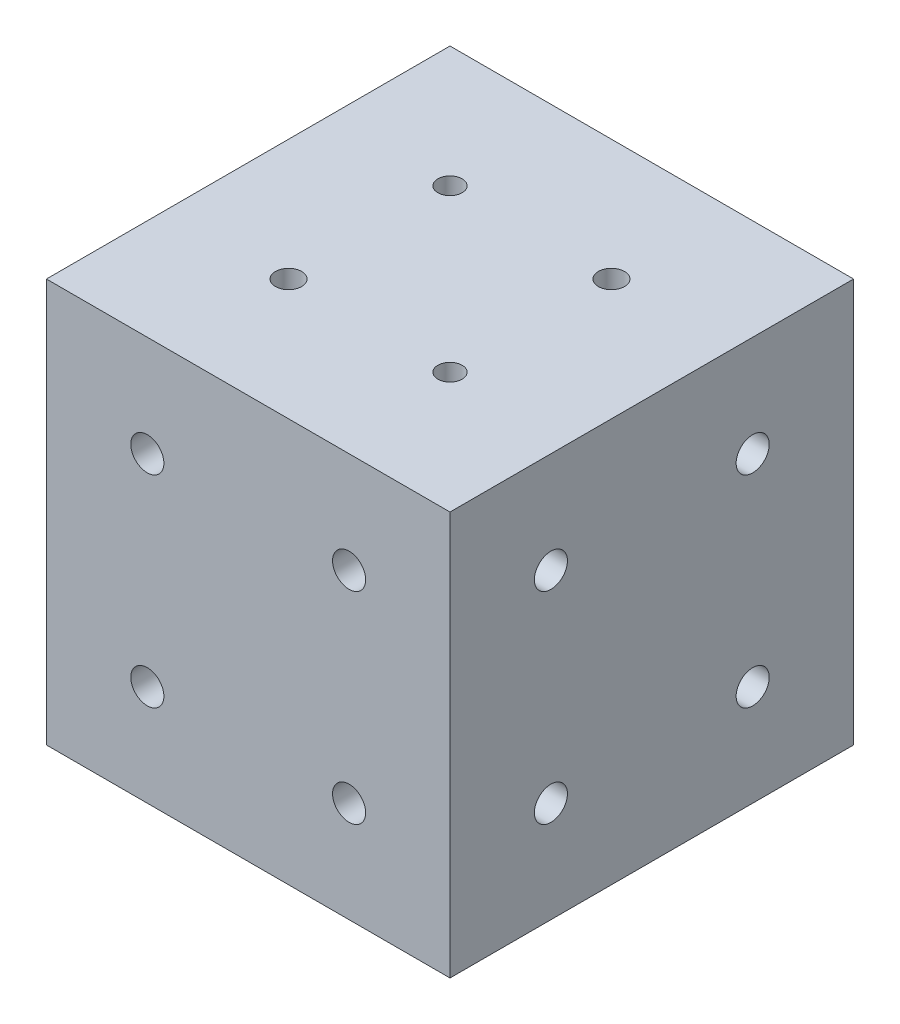
ISO-10303-21;
HEADER;
FILE_DESCRIPTION(('STEP AP214'),'2;1');
FILE_NAME('part.step','',(''),(''),'','','');
FILE_SCHEMA(('AUTOMOTIVE_DESIGN { 1 0 10303 214 1 1 1 1 }'));
ENDSEC;
DATA;
#1=APPLICATION_CONTEXT('core data for automotive mechanical design processes');
#2=APPLICATION_PROTOCOL_DEFINITION('international standard','automotive_design',2000,#1);
#3=PRODUCT_CONTEXT('',#1,'mechanical');
#4=PRODUCT('Part','Part','',(#3));
#5=PRODUCT_RELATED_PRODUCT_CATEGORY('part','',(#4));
#6=PRODUCT_DEFINITION_FORMATION('','',#4);
#7=PRODUCT_DEFINITION_CONTEXT('part definition',#1,'design');
#8=PRODUCT_DEFINITION('design','',#6,#7);
#9=PRODUCT_DEFINITION_SHAPE('','',#8);
#10=(LENGTH_UNIT() NAMED_UNIT(*) SI_UNIT(.MILLI.,.METRE.));
#11=(NAMED_UNIT(*) PLANE_ANGLE_UNIT() SI_UNIT($,.RADIAN.));
#12=(NAMED_UNIT(*) SI_UNIT($,.STERADIAN.) SOLID_ANGLE_UNIT());
#13=UNCERTAINTY_MEASURE_WITH_UNIT(LENGTH_MEASURE(1.E-05),#10,'distance_accuracy_value','');
#14=(GEOMETRIC_REPRESENTATION_CONTEXT(3) GLOBAL_UNCERTAINTY_ASSIGNED_CONTEXT((#13)) GLOBAL_UNIT_ASSIGNED_CONTEXT((#10,
#11,#12)) REPRESENTATION_CONTEXT('',''));
#15=CARTESIAN_POINT('',(0.,0.,0.));
#16=DIRECTION('',(0.,0.,1.));
#17=DIRECTION('',(1.,0.,0.));
#18=AXIS2_PLACEMENT_3D('',#15,#16,#17);
#19=CARTESIAN_POINT('',(-20.,-50.,-20.));
#20=DIRECTION('',(0.,1.,0.));
#21=DIRECTION('',(0.,0.,1.));
#22=AXIS2_PLACEMENT_3D('',#19,#20,#21);
#23=CYLINDRICAL_SURFACE('',#22,3.);
#24=CARTESIAN_POINT('',(-20.,50.,-20.));
#25=DIRECTION('',(0.,1.,0.));
#26=DIRECTION('',(0.,0.,1.));
#27=AXIS2_PLACEMENT_3D('',#24,#25,#26);
#28=CIRCLE('',#27,3.);
#29=CARTESIAN_POINT('',(-20.,50.,-17.));
#30=VERTEX_POINT('',#29);
#31=EDGE_CURVE('E226',#30,#30,#28,.T.);
#32=ORIENTED_EDGE('',*,*,#31,.T.);
#33=EDGE_LOOP('',(#32));
#34=FACE_BOUND('',#33,.T.);
#35=CARTESIAN_POINT('',(-20.,40.,-20.));
#36=DIRECTION('',(0.,-1.,0.));
#37=DIRECTION('',(0.,0.,-1.));
#38=AXIS2_PLACEMENT_3D('',#35,#36,#37);
#39=CIRCLE('',#38,3.);
#40=CARTESIAN_POINT('',(-20.,40.,-23.));
#41=VERTEX_POINT('',#40);
#42=EDGE_CURVE('E168',#41,#41,#39,.F.);
#43=ORIENTED_EDGE('',*,*,#42,.F.);
#44=EDGE_LOOP('',(#43));
#45=FACE_BOUND('',#44,.T.);
#46=ADVANCED_FACE('F41',(#34,#45),#23,.F.);
#47=CARTESIAN_POINT('',(-20.,-50.,20.));
#48=DIRECTION('',(0.,1.,0.));
#49=DIRECTION('',(0.,0.,1.));
#50=AXIS2_PLACEMENT_3D('',#47,#48,#49);
#51=CYLINDRICAL_SURFACE('',#50,3.25);
#52=CARTESIAN_POINT('',(-20.,50.,20.));
#53=DIRECTION('',(0.,1.,0.));
#54=DIRECTION('',(0.,0.,1.));
#55=AXIS2_PLACEMENT_3D('',#52,#53,#54);
#56=CIRCLE('',#55,3.25);
#57=CARTESIAN_POINT('',(-20.,50.,23.25));
#58=VERTEX_POINT('',#57);
#59=EDGE_CURVE('E237',#58,#58,#56,.T.);
#60=ORIENTED_EDGE('',*,*,#59,.T.);
#61=EDGE_LOOP('',(#60));
#62=FACE_BOUND('',#61,.T.);
#63=CARTESIAN_POINT('',(-20.,40.,20.));
#64=DIRECTION('',(0.,-1.,0.));
#65=DIRECTION('',(0.,0.,-1.));
#66=AXIS2_PLACEMENT_3D('',#63,#64,#65);
#67=CIRCLE('',#66,3.25);
#68=CARTESIAN_POINT('',(-20.,40.,16.75));
#69=VERTEX_POINT('',#68);
#70=EDGE_CURVE('E170',#69,#69,#67,.F.);
#71=ORIENTED_EDGE('',*,*,#70,.F.);
#72=EDGE_LOOP('',(#71));
#73=FACE_BOUND('',#72,.T.);
#74=ADVANCED_FACE('F344',(#62,#73),#51,.F.);
#75=CARTESIAN_POINT('',(20.,-50.,-20.));
#76=DIRECTION('',(0.,1.,0.));
#77=DIRECTION('',(0.,0.,1.));
#78=AXIS2_PLACEMENT_3D('',#75,#76,#77);
#79=CYLINDRICAL_SURFACE('',#78,3.25);
#80=CARTESIAN_POINT('',(20.,50.,-20.));
#81=DIRECTION('',(0.,1.,0.));
#82=DIRECTION('',(0.,0.,1.));
#83=AXIS2_PLACEMENT_3D('',#80,#81,#82);
#84=CIRCLE('',#83,3.25);
#85=CARTESIAN_POINT('',(20.,50.,-16.75));
#86=VERTEX_POINT('',#85);
#87=EDGE_CURVE('E230',#86,#86,#84,.T.);
#88=ORIENTED_EDGE('',*,*,#87,.T.);
#89=EDGE_LOOP('',(#88));
#90=FACE_BOUND('',#89,.T.);
#91=CARTESIAN_POINT('',(20.,40.,-20.));
#92=DIRECTION('',(0.,-1.,0.));
#93=DIRECTION('',(0.,0.,-1.));
#94=AXIS2_PLACEMENT_3D('',#91,#92,#93);
#95=CIRCLE('',#94,3.25);
#96=CARTESIAN_POINT('',(20.,40.,-23.25));
#97=VERTEX_POINT('',#96);
#98=EDGE_CURVE('E163',#97,#97,#95,.F.);
#99=ORIENTED_EDGE('',*,*,#98,.F.);
#100=EDGE_LOOP('',(#99));
#101=FACE_BOUND('',#100,.T.);
#102=ADVANCED_FACE('F348',(#90,#101),#79,.F.);
#103=CARTESIAN_POINT('',(20.,-50.,20.));
#104=DIRECTION('',(0.,1.,0.));
#105=DIRECTION('',(0.,0.,1.));
#106=AXIS2_PLACEMENT_3D('',#103,#104,#105);
#107=CYLINDRICAL_SURFACE('',#106,3.);
#108=CARTESIAN_POINT('',(20.,50.,20.));
#109=DIRECTION('',(0.,1.,0.));
#110=DIRECTION('',(0.,0.,1.));
#111=AXIS2_PLACEMENT_3D('',#108,#109,#110);
#112=CIRCLE('',#111,3.);
#113=CARTESIAN_POINT('',(20.,50.,23.));
#114=VERTEX_POINT('',#113);
#115=EDGE_CURVE('E224',#114,#114,#112,.T.);
#116=ORIENTED_EDGE('',*,*,#115,.T.);
#117=EDGE_LOOP('',(#116));
#118=FACE_BOUND('',#117,.T.);
#119=CARTESIAN_POINT('',(20.,40.,20.));
#120=DIRECTION('',(0.,-1.,0.));
#121=DIRECTION('',(0.,0.,-1.));
#122=AXIS2_PLACEMENT_3D('',#119,#120,#121);
#123=CIRCLE('',#122,3.);
#124=CARTESIAN_POINT('',(20.,40.,17.));
#125=VERTEX_POINT('',#124);
#126=EDGE_CURVE('E159',#125,#125,#123,.F.);
#127=ORIENTED_EDGE('',*,*,#126,.F.);
#128=EDGE_LOOP('',(#127));
#129=FACE_BOUND('',#128,.T.);
#130=ADVANCED_FACE('F447',(#118,#129),#107,.F.);
#131=CARTESIAN_POINT('',(-25.,25.,-50.));
#132=DIRECTION('',(0.,0.,1.));
#133=DIRECTION('',(1.,0.,0.));
#134=AXIS2_PLACEMENT_3D('',#131,#132,#133);
#135=CYLINDRICAL_SURFACE('',#134,4.1);
#136=CARTESIAN_POINT('',(-25.,25.,42.5));
#137=DIRECTION('',(0.,0.,1.));
#138=DIRECTION('',(1.,0.,0.));
#139=AXIS2_PLACEMENT_3D('',#136,#137,#138);
#140=CIRCLE('',#139,4.1);
#141=CARTESIAN_POINT('',(-20.9,25.,42.5));
#142=VERTEX_POINT('',#141);
#143=EDGE_CURVE('E218',#142,#142,#140,.F.);
#144=ORIENTED_EDGE('',*,*,#143,.T.);
#145=EDGE_LOOP('',(#144));
#146=FACE_BOUND('',#145,.T.);
#147=CARTESIAN_POINT('',(-25.,25.,50.));
#148=DIRECTION('',(0.,0.,1.));
#149=DIRECTION('',(1.,0.,0.));
#150=AXIS2_PLACEMENT_3D('',#147,#148,#149);
#151=CIRCLE('',#150,4.1);
#152=CARTESIAN_POINT('',(-20.9,25.,50.));
#153=VERTEX_POINT('',#152);
#154=EDGE_CURVE('E273',#153,#153,#151,.T.);
#155=ORIENTED_EDGE('',*,*,#154,.T.);
#156=EDGE_LOOP('',(#155));
#157=FACE_BOUND('',#156,.T.);
#158=ADVANCED_FACE('F416',(#146,#157),#135,.F.);
#159=CARTESIAN_POINT('',(25.,25.,-50.));
#160=DIRECTION('',(0.,0.,1.));
#161=DIRECTION('',(1.,0.,0.));
#162=AXIS2_PLACEMENT_3D('',#159,#160,#161);
#163=CYLINDRICAL_SURFACE('',#162,4.1);
#164=CARTESIAN_POINT('',(25.,25.,42.5));
#165=DIRECTION('',(0.,0.,1.));
#166=DIRECTION('',(1.,0.,0.));
#167=AXIS2_PLACEMENT_3D('',#164,#165,#166);
#168=CIRCLE('',#167,4.1);
#169=CARTESIAN_POINT('',(29.1,25.,42.5));
#170=VERTEX_POINT('',#169);
#171=EDGE_CURVE('E216',#170,#170,#168,.F.);
#172=ORIENTED_EDGE('',*,*,#171,.T.);
#173=EDGE_LOOP('',(#172));
#174=FACE_BOUND('',#173,.T.);
#175=CARTESIAN_POINT('',(25.,25.,50.));
#176=DIRECTION('',(0.,0.,1.));
#177=DIRECTION('',(1.,0.,0.));
#178=AXIS2_PLACEMENT_3D('',#175,#176,#177);
#179=CIRCLE('',#178,4.1);
#180=CARTESIAN_POINT('',(29.1,25.,50.));
#181=VERTEX_POINT('',#180);
#182=EDGE_CURVE('E271',#181,#181,#179,.T.);
#183=ORIENTED_EDGE('',*,*,#182,.T.);
#184=EDGE_LOOP('',(#183));
#185=FACE_BOUND('',#184,.T.);
#186=ADVANCED_FACE('F435',(#174,#185),#163,.F.);
#187=CARTESIAN_POINT('',(25.,-25.,-50.));
#188=DIRECTION('',(0.,0.,1.));
#189=DIRECTION('',(1.,0.,0.));
#190=AXIS2_PLACEMENT_3D('',#187,#188,#189);
#191=CYLINDRICAL_SURFACE('',#190,4.1);
#192=CARTESIAN_POINT('',(25.,-25.,42.5));
#193=DIRECTION('',(0.,0.,1.));
#194=DIRECTION('',(1.,0.,0.));
#195=AXIS2_PLACEMENT_3D('',#192,#193,#194);
#196=CIRCLE('',#195,4.1);
#197=CARTESIAN_POINT('',(29.1,-25.,42.5));
#198=VERTEX_POINT('',#197);
#199=EDGE_CURVE('E213',#198,#198,#196,.F.);
#200=ORIENTED_EDGE('',*,*,#199,.T.);
#201=EDGE_LOOP('',(#200));
#202=FACE_BOUND('',#201,.T.);
#203=CARTESIAN_POINT('',(25.,-25.,50.));
#204=DIRECTION('',(0.,0.,1.));
#205=DIRECTION('',(1.,0.,0.));
#206=AXIS2_PLACEMENT_3D('',#203,#204,#205);
#207=CIRCLE('',#206,4.1);
#208=CARTESIAN_POINT('',(29.1,-25.,50.));
#209=VERTEX_POINT('',#208);
#210=EDGE_CURVE('E279',#209,#209,#207,.T.);
#211=ORIENTED_EDGE('',*,*,#210,.T.);
#212=EDGE_LOOP('',(#211));
#213=FACE_BOUND('',#212,.T.);
#214=ADVANCED_FACE('F437',(#202,#213),#191,.F.);
#215=CARTESIAN_POINT('',(-25.,-25.,-50.));
#216=DIRECTION('',(0.,0.,1.));
#217=DIRECTION('',(1.,0.,0.));
#218=AXIS2_PLACEMENT_3D('',#215,#216,#217);
#219=CYLINDRICAL_SURFACE('',#218,4.1);
#220=CARTESIAN_POINT('',(-25.,-25.,42.5));
#221=DIRECTION('',(0.,0.,1.));
#222=DIRECTION('',(1.,0.,0.));
#223=AXIS2_PLACEMENT_3D('',#220,#221,#222);
#224=CIRCLE('',#223,4.1);
#225=CARTESIAN_POINT('',(-20.9,-25.,42.5));
#226=VERTEX_POINT('',#225);
#227=EDGE_CURVE('E44',#226,#226,#224,.F.);
#228=ORIENTED_EDGE('',*,*,#227,.T.);
#229=EDGE_LOOP('',(#228));
#230=FACE_BOUND('',#229,.T.);
#231=CARTESIAN_POINT('',(-25.,-25.,50.));
#232=DIRECTION('',(0.,0.,1.));
#233=DIRECTION('',(1.,0.,0.));
#234=AXIS2_PLACEMENT_3D('',#231,#232,#233);
#235=CIRCLE('',#234,4.1);
#236=CARTESIAN_POINT('',(-20.9,-25.,50.));
#237=VERTEX_POINT('',#236);
#238=EDGE_CURVE('E283',#237,#237,#235,.T.);
#239=ORIENTED_EDGE('',*,*,#238,.T.);
#240=EDGE_LOOP('',(#239));
#241=FACE_BOUND('',#240,.T.);
#242=ADVANCED_FACE('F393',(#230,#241),#219,.F.);
#243=CARTESIAN_POINT('',(50.,-50.,50.));
#244=DIRECTION('',(-1.,0.,0.));
#245=DIRECTION('',(0.,0.,1.));
#246=AXIS2_PLACEMENT_3D('',#243,#244,#245);
#247=PLANE('',#246);
#248=CARTESIAN_POINT('',(50.,-25.,25.));
#249=DIRECTION('',(1.,0.,0.));
#250=DIRECTION('',(0.,0.,-1.));
#251=AXIS2_PLACEMENT_3D('',#248,#249,#250);
#252=CIRCLE('',#251,4.1);
#253=CARTESIAN_POINT('',(50.,-25.,20.9));
#254=VERTEX_POINT('',#253);
#255=EDGE_CURVE('E257',#254,#254,#252,.T.);
#256=ORIENTED_EDGE('',*,*,#255,.F.);
#257=EDGE_LOOP('',(#256));
#258=FACE_BOUND('',#257,.T.);
#259=CARTESIAN_POINT('',(50.,-25.,-25.));
#260=DIRECTION('',(1.,0.,0.));
#261=DIRECTION('',(0.,0.,-1.));
#262=AXIS2_PLACEMENT_3D('',#259,#260,#261);
#263=CIRCLE('',#262,4.1);
#264=CARTESIAN_POINT('',(50.,-25.,-29.1));
#265=VERTEX_POINT('',#264);
#266=EDGE_CURVE('E255',#265,#265,#263,.T.);
#267=ORIENTED_EDGE('',*,*,#266,.F.);
#268=EDGE_LOOP('',(#267));
#269=FACE_BOUND('',#268,.T.);
#270=CARTESIAN_POINT('',(50.,25.,-25.));
#271=DIRECTION('',(1.,0.,0.));
#272=DIRECTION('',(0.,0.,-1.));
#273=AXIS2_PLACEMENT_3D('',#270,#271,#272);
#274=CIRCLE('',#273,4.1);
#275=CARTESIAN_POINT('',(50.,25.,-29.1));
#276=VERTEX_POINT('',#275);
#277=EDGE_CURVE('E249',#276,#276,#274,.T.);
#278=ORIENTED_EDGE('',*,*,#277,.F.);
#279=EDGE_LOOP('',(#278));
#280=FACE_BOUND('',#279,.T.);
#281=CARTESIAN_POINT('',(50.,25.,25.));
#282=DIRECTION('',(1.,0.,0.));
#283=DIRECTION('',(0.,0.,-1.));
#284=AXIS2_PLACEMENT_3D('',#281,#282,#283);
#285=CIRCLE('',#284,4.1);
#286=CARTESIAN_POINT('',(50.,25.,20.9));
#287=VERTEX_POINT('',#286);
#288=EDGE_CURVE('E246',#287,#287,#285,.T.);
#289=ORIENTED_EDGE('',*,*,#288,.F.);
#290=EDGE_LOOP('',(#289));
#291=FACE_BOUND('',#290,.T.);
#292=DIRECTION('',(0.,1.,0.));
#293=VECTOR('',#292,1.);
#294=CARTESIAN_POINT('',(50.,-50.,-50.));
#295=LINE('',#294,#293);
#296=CARTESIAN_POINT('',(50.,-50.,-50.));
#297=VERTEX_POINT('',#296);
#298=CARTESIAN_POINT('',(50.,50.,-50.));
#299=VERTEX_POINT('',#298);
#300=EDGE_CURVE('E295',#297,#299,#295,.T.);
#301=ORIENTED_EDGE('',*,*,#300,.T.);
#302=DIRECTION('',(0.,0.,-1.));
#303=VECTOR('',#302,1.);
#304=CARTESIAN_POINT('',(50.,50.,50.));
#305=LINE('',#304,#303);
#306=CARTESIAN_POINT('',(50.,50.,50.));
#307=VERTEX_POINT('',#306);
#308=EDGE_CURVE('E11',#307,#299,#305,.T.);
#309=ORIENTED_EDGE('',*,*,#308,.F.);
#310=DIRECTION('',(0.,1.,0.));
#311=VECTOR('',#310,1.);
#312=CARTESIAN_POINT('',(50.,-50.,50.));
#313=LINE('',#312,#311);
#314=CARTESIAN_POINT('',(50.,-50.,50.));
#315=VERTEX_POINT('',#314);
#316=EDGE_CURVE('E293',#315,#307,#313,.T.);
#317=ORIENTED_EDGE('',*,*,#316,.F.);
#318=DIRECTION('',(0.,0.,-1.));
#319=VECTOR('',#318,1.);
#320=CARTESIAN_POINT('',(50.,-50.,50.));
#321=LINE('',#320,#319);
#322=EDGE_CURVE('E303',#315,#297,#321,.T.);
#323=ORIENTED_EDGE('',*,*,#322,.T.);
#324=EDGE_LOOP('',(#301,#309,#317,#323));
#325=FACE_BOUND('',#324,.T.);
#326=ADVANCED_FACE('F43',(#258,#269,#280,#291,#325),#247,.F.);
#327=CARTESIAN_POINT('',(-50.,50.,50.));
#328=DIRECTION('',(0.,-1.,0.));
#329=DIRECTION('',(0.,0.,-1.));
#330=AXIS2_PLACEMENT_3D('',#327,#328,#329);
#331=PLANE('',#330);
#332=ORIENTED_EDGE('',*,*,#59,.F.);
#333=EDGE_LOOP('',(#332));
#334=FACE_BOUND('',#333,.T.);
#335=ORIENTED_EDGE('',*,*,#87,.F.);
#336=EDGE_LOOP('',(#335));
#337=FACE_BOUND('',#336,.T.);
#338=ORIENTED_EDGE('',*,*,#115,.F.);
#339=EDGE_LOOP('',(#338));
#340=FACE_BOUND('',#339,.T.);
#341=ORIENTED_EDGE('',*,*,#31,.F.);
#342=EDGE_LOOP('',(#341));
#343=FACE_BOUND('',#342,.T.);
#344=DIRECTION('',(-1.,0.,0.));
#345=VECTOR('',#344,1.);
#346=CARTESIAN_POINT('',(-50.,50.,-50.));
#347=LINE('',#346,#345);
#348=CARTESIAN_POINT('',(-50.,50.,-50.));
#349=VERTEX_POINT('',#348);
#350=EDGE_CURVE('E305',#299,#349,#347,.T.);
#351=ORIENTED_EDGE('',*,*,#350,.T.);
#352=DIRECTION('',(0.,0.,-1.));
#353=VECTOR('',#352,1.);
#354=CARTESIAN_POINT('',(-50.,50.,50.));
#355=LINE('',#354,#353);
#356=CARTESIAN_POINT('',(-50.,50.,50.));
#357=VERTEX_POINT('',#356);
#358=EDGE_CURVE('E51',#357,#349,#355,.T.);
#359=ORIENTED_EDGE('',*,*,#358,.F.);
#360=DIRECTION('',(-1.,0.,0.));
#361=VECTOR('',#360,1.);
#362=CARTESIAN_POINT('',(-50.,50.,50.));
#363=LINE('',#362,#361);
#364=EDGE_CURVE('E93',#307,#357,#363,.T.);
#365=ORIENTED_EDGE('',*,*,#364,.F.);
#366=ORIENTED_EDGE('',*,*,#308,.T.);
#367=EDGE_LOOP('',(#351,#359,#365,#366));
#368=FACE_BOUND('',#367,.T.);
#369=ADVANCED_FACE('F384',(#334,#337,#340,#343,#368),#331,.F.);
#370=CARTESIAN_POINT('',(-50.,-50.,50.));
#371=DIRECTION('',(1.,0.,0.));
#372=DIRECTION('',(0.,0.,-1.));
#373=AXIS2_PLACEMENT_3D('',#370,#371,#372);
#374=PLANE('',#373);
#375=CARTESIAN_POINT('',(-50.,-25.,25.));
#376=DIRECTION('',(1.,0.,0.));
#377=DIRECTION('',(0.,0.,-1.));
#378=AXIS2_PLACEMENT_3D('',#375,#376,#377);
#379=CIRCLE('',#378,4.1);
#380=CARTESIAN_POINT('',(-50.,-25.,20.9));
#381=VERTEX_POINT('',#380);
#382=EDGE_CURVE('E243',#381,#381,#379,.T.);
#383=ORIENTED_EDGE('',*,*,#382,.T.);
#384=EDGE_LOOP('',(#383));
#385=FACE_BOUND('',#384,.T.);
#386=CARTESIAN_POINT('',(-50.,-25.,-25.));
#387=DIRECTION('',(1.,0.,0.));
#388=DIRECTION('',(0.,0.,-1.));
#389=AXIS2_PLACEMENT_3D('',#386,#387,#388);
#390=CIRCLE('',#389,4.1);
#391=CARTESIAN_POINT('',(-50.,-25.,-29.1));
#392=VERTEX_POINT('',#391);
#393=EDGE_CURVE('E260',#392,#392,#390,.T.);
#394=ORIENTED_EDGE('',*,*,#393,.T.);
#395=EDGE_LOOP('',(#394));
#396=FACE_BOUND('',#395,.T.);
#397=CARTESIAN_POINT('',(-50.,25.,-25.));
#398=DIRECTION('',(1.,0.,0.));
#399=DIRECTION('',(0.,0.,-1.));
#400=AXIS2_PLACEMENT_3D('',#397,#398,#399);
#401=CIRCLE('',#400,4.1);
#402=CARTESIAN_POINT('',(-50.,25.,-29.1));
#403=VERTEX_POINT('',#402);
#404=EDGE_CURVE('E253',#403,#403,#401,.T.);
#405=ORIENTED_EDGE('',*,*,#404,.T.);
#406=EDGE_LOOP('',(#405));
#407=FACE_BOUND('',#406,.T.);
#408=CARTESIAN_POINT('',(-50.,25.,25.));
#409=DIRECTION('',(1.,0.,0.));
#410=DIRECTION('',(0.,0.,-1.));
#411=AXIS2_PLACEMENT_3D('',#408,#409,#410);
#412=CIRCLE('',#411,4.1);
#413=CARTESIAN_POINT('',(-50.,25.,20.9));
#414=VERTEX_POINT('',#413);
#415=EDGE_CURVE('E264',#414,#414,#412,.T.);
#416=ORIENTED_EDGE('',*,*,#415,.T.);
#417=EDGE_LOOP('',(#416));
#418=FACE_BOUND('',#417,.T.);
#419=DIRECTION('',(0.,-1.,0.));
#420=VECTOR('',#419,1.);
#421=CARTESIAN_POINT('',(-50.,-50.,-50.));
#422=LINE('',#421,#420);
#423=CARTESIAN_POINT('',(-50.,-50.,-50.));
#424=VERTEX_POINT('',#423);
#425=EDGE_CURVE('E79',#349,#424,#422,.T.);
#426=ORIENTED_EDGE('',*,*,#425,.T.);
#427=DIRECTION('',(0.,0.,-1.));
#428=VECTOR('',#427,1.);
#429=CARTESIAN_POINT('',(-50.,-50.,50.));
#430=LINE('',#429,#428);
#431=CARTESIAN_POINT('',(-50.,-50.,50.));
#432=VERTEX_POINT('',#431);
#433=EDGE_CURVE('E310',#432,#424,#430,.T.);
#434=ORIENTED_EDGE('',*,*,#433,.F.);
#435=DIRECTION('',(0.,-1.,0.));
#436=VECTOR('',#435,1.);
#437=CARTESIAN_POINT('',(-50.,-50.,50.));
#438=LINE('',#437,#436);
#439=EDGE_CURVE('E299',#357,#432,#438,.T.);
#440=ORIENTED_EDGE('',*,*,#439,.F.);
#441=ORIENTED_EDGE('',*,*,#358,.T.);
#442=EDGE_LOOP('',(#426,#434,#440,#441));
#443=FACE_BOUND('',#442,.T.);
#444=ADVANCED_FACE('F372',(#385,#396,#407,#418,#443),#374,.F.);
#445=CARTESIAN_POINT('',(-50.,-50.,50.));
#446=DIRECTION('',(0.,1.,0.));
#447=DIRECTION('',(0.,0.,1.));
#448=AXIS2_PLACEMENT_3D('',#445,#446,#447);
#449=PLANE('',#448);
#450=CARTESIAN_POINT('',(-20.,-50.,20.));
#451=DIRECTION('',(0.,1.,0.));
#452=DIRECTION('',(0.,0.,1.));
#453=AXIS2_PLACEMENT_3D('',#450,#451,#452);
#454=CIRCLE('',#453,3.25);
#455=CARTESIAN_POINT('',(-20.,-50.,23.25));
#456=VERTEX_POINT('',#455);
#457=EDGE_CURVE('E225',#456,#456,#454,.T.);
#458=ORIENTED_EDGE('',*,*,#457,.T.);
#459=EDGE_LOOP('',(#458));
#460=FACE_BOUND('',#459,.T.);
#461=CARTESIAN_POINT('',(20.,-50.,-20.));
#462=DIRECTION('',(0.,1.,0.));
#463=DIRECTION('',(0.,0.,1.));
#464=AXIS2_PLACEMENT_3D('',#461,#462,#463);
#465=CIRCLE('',#464,3.25);
#466=CARTESIAN_POINT('',(20.,-50.,-16.75));
#467=VERTEX_POINT('',#466);
#468=EDGE_CURVE('E232',#467,#467,#465,.T.);
#469=ORIENTED_EDGE('',*,*,#468,.T.);
#470=EDGE_LOOP('',(#469));
#471=FACE_BOUND('',#470,.T.);
#472=CARTESIAN_POINT('',(20.,-50.,20.));
#473=DIRECTION('',(0.,1.,0.));
#474=DIRECTION('',(0.,0.,1.));
#475=AXIS2_PLACEMENT_3D('',#472,#473,#474);
#476=CIRCLE('',#475,3.);
#477=CARTESIAN_POINT('',(20.,-50.,23.));
#478=VERTEX_POINT('',#477);
#479=EDGE_CURVE('E227',#478,#478,#476,.T.);
#480=ORIENTED_EDGE('',*,*,#479,.T.);
#481=EDGE_LOOP('',(#480));
#482=FACE_BOUND('',#481,.T.);
#483=CARTESIAN_POINT('',(-20.,-50.,-20.));
#484=DIRECTION('',(0.,1.,0.));
#485=DIRECTION('',(0.,0.,1.));
#486=AXIS2_PLACEMENT_3D('',#483,#484,#485);
#487=CIRCLE('',#486,3.);
#488=CARTESIAN_POINT('',(-20.,-50.,-17.));
#489=VERTEX_POINT('',#488);
#490=EDGE_CURVE('E241',#489,#489,#487,.T.);
#491=ORIENTED_EDGE('',*,*,#490,.T.);
#492=EDGE_LOOP('',(#491));
#493=FACE_BOUND('',#492,.T.);
#494=DIRECTION('',(1.,0.,0.));
#495=VECTOR('',#494,1.);
#496=CARTESIAN_POINT('',(-50.,-50.,-50.));
#497=LINE('',#496,#495);
#498=EDGE_CURVE('E85',#424,#297,#497,.T.);
#499=ORIENTED_EDGE('',*,*,#498,.T.);
#500=ORIENTED_EDGE('',*,*,#322,.F.);
#501=DIRECTION('',(1.,0.,0.));
#502=VECTOR('',#501,1.);
#503=CARTESIAN_POINT('',(-50.,-50.,50.));
#504=LINE('',#503,#502);
#505=EDGE_CURVE('E58',#432,#315,#504,.T.);
#506=ORIENTED_EDGE('',*,*,#505,.F.);
#507=ORIENTED_EDGE('',*,*,#433,.T.);
#508=EDGE_LOOP('',(#499,#500,#506,#507));
#509=FACE_BOUND('',#508,.T.);
#510=ADVANCED_FACE('F375',(#460,#471,#482,#493,#509),#449,.F.);
#511=CARTESIAN_POINT('',(0.,0.,50.));
#512=DIRECTION('',(0.,0.,-1.));
#513=DIRECTION('',(-1.,0.,0.));
#514=AXIS2_PLACEMENT_3D('',#511,#512,#513);
#515=PLANE('',#514);
#516=ORIENTED_EDGE('',*,*,#238,.F.);
#517=EDGE_LOOP('',(#516));
#518=FACE_BOUND('',#517,.T.);
#519=ORIENTED_EDGE('',*,*,#210,.F.);
#520=EDGE_LOOP('',(#519));
#521=FACE_BOUND('',#520,.T.);
#522=ORIENTED_EDGE('',*,*,#182,.F.);
#523=EDGE_LOOP('',(#522));
#524=FACE_BOUND('',#523,.T.);
#525=ORIENTED_EDGE('',*,*,#154,.F.);
#526=EDGE_LOOP('',(#525));
#527=FACE_BOUND('',#526,.T.);
#528=ORIENTED_EDGE('',*,*,#316,.T.);
#529=ORIENTED_EDGE('',*,*,#364,.T.);
#530=ORIENTED_EDGE('',*,*,#439,.T.);
#531=ORIENTED_EDGE('',*,*,#505,.T.);
#532=EDGE_LOOP('',(#528,#529,#530,#531));
#533=FACE_BOUND('',#532,.T.);
#534=ADVANCED_FACE('F373',(#518,#521,#524,#527,#533),#515,.F.);
#535=CARTESIAN_POINT('',(0.,0.,-50.));
#536=DIRECTION('',(0.,0.,-1.));
#537=DIRECTION('',(-1.,0.,0.));
#538=AXIS2_PLACEMENT_3D('',#535,#536,#537);
#539=PLANE('',#538);
#540=CARTESIAN_POINT('',(-25.,-25.,-50.));
#541=DIRECTION('',(0.,0.,1.));
#542=DIRECTION('',(1.,0.,0.));
#543=AXIS2_PLACEMENT_3D('',#540,#541,#542);
#544=CIRCLE('',#543,4.1);
#545=CARTESIAN_POINT('',(-20.9,-25.,-50.));
#546=VERTEX_POINT('',#545);
#547=EDGE_CURVE('E268',#546,#546,#544,.T.);
#548=ORIENTED_EDGE('',*,*,#547,.T.);
#549=EDGE_LOOP('',(#548));
#550=FACE_BOUND('',#549,.T.);
#551=CARTESIAN_POINT('',(25.,-25.,-50.));
#552=DIRECTION('',(0.,0.,1.));
#553=DIRECTION('',(1.,0.,0.));
#554=AXIS2_PLACEMENT_3D('',#551,#552,#553);
#555=CIRCLE('',#554,4.1);
#556=CARTESIAN_POINT('',(29.1,-25.,-50.));
#557=VERTEX_POINT('',#556);
#558=EDGE_CURVE('E281',#557,#557,#555,.T.);
#559=ORIENTED_EDGE('',*,*,#558,.T.);
#560=EDGE_LOOP('',(#559));
#561=FACE_BOUND('',#560,.T.);
#562=CARTESIAN_POINT('',(25.,25.,-50.));
#563=DIRECTION('',(0.,0.,1.));
#564=DIRECTION('',(1.,0.,0.));
#565=AXIS2_PLACEMENT_3D('',#562,#563,#564);
#566=CIRCLE('',#565,4.1);
#567=CARTESIAN_POINT('',(29.1,25.,-50.));
#568=VERTEX_POINT('',#567);
#569=EDGE_CURVE('E274',#568,#568,#566,.T.);
#570=ORIENTED_EDGE('',*,*,#569,.T.);
#571=EDGE_LOOP('',(#570));
#572=FACE_BOUND('',#571,.T.);
#573=CARTESIAN_POINT('',(-25.,25.,-50.));
#574=DIRECTION('',(0.,0.,1.));
#575=DIRECTION('',(1.,0.,0.));
#576=AXIS2_PLACEMENT_3D('',#573,#574,#575);
#577=CIRCLE('',#576,4.1);
#578=CARTESIAN_POINT('',(-20.9,25.,-50.));
#579=VERTEX_POINT('',#578);
#580=EDGE_CURVE('E290',#579,#579,#577,.T.);
#581=ORIENTED_EDGE('',*,*,#580,.T.);
#582=EDGE_LOOP('',(#581));
#583=FACE_BOUND('',#582,.T.);
#584=ORIENTED_EDGE('',*,*,#300,.F.);
#585=ORIENTED_EDGE('',*,*,#498,.F.);
#586=ORIENTED_EDGE('',*,*,#425,.F.);
#587=ORIENTED_EDGE('',*,*,#350,.F.);
#588=EDGE_LOOP('',(#584,#585,#586,#587));
#589=FACE_BOUND('',#588,.T.);
#590=ADVANCED_FACE('F381',(#550,#561,#572,#583,#589),#539,.T.);
#591=CARTESIAN_POINT('',(-25.,25.,-42.5));
#592=DIRECTION('',(0.,0.,-1.));
#593=DIRECTION('',(-1.,0.,0.));
#594=AXIS2_PLACEMENT_3D('',#591,#592,#593);
#595=CIRCLE('',#594,4.1);
#596=CARTESIAN_POINT('',(-29.1,25.,-42.5));
#597=VERTEX_POINT('',#596);
#598=EDGE_CURVE('E209',#597,#597,#595,.F.);
#599=ORIENTED_EDGE('',*,*,#598,.T.);
#600=EDGE_LOOP('',(#599));
#601=FACE_BOUND('',#600,.T.);
#602=ORIENTED_EDGE('',*,*,#580,.F.);
#603=EDGE_LOOP('',(#602));
#604=FACE_BOUND('',#603,.T.);
#605=ADVANCED_FACE('F410',(#601,#604),#135,.F.);
#606=CARTESIAN_POINT('',(25.,25.,-42.5));
#607=DIRECTION('',(0.,0.,-1.));
#608=DIRECTION('',(-1.,0.,0.));
#609=AXIS2_PLACEMENT_3D('',#606,#607,#608);
#610=CIRCLE('',#609,4.1);
#611=CARTESIAN_POINT('',(20.9,25.,-42.5));
#612=VERTEX_POINT('',#611);
#613=EDGE_CURVE('E210',#612,#612,#610,.F.);
#614=ORIENTED_EDGE('',*,*,#613,.T.);
#615=EDGE_LOOP('',(#614));
#616=FACE_BOUND('',#615,.T.);
#617=ORIENTED_EDGE('',*,*,#569,.F.);
#618=EDGE_LOOP('',(#617));
#619=FACE_BOUND('',#618,.T.);
#620=ADVANCED_FACE('F411',(#616,#619),#163,.F.);
#621=CARTESIAN_POINT('',(25.,-25.,-42.5));
#622=DIRECTION('',(0.,0.,-1.));
#623=DIRECTION('',(-1.,0.,0.));
#624=AXIS2_PLACEMENT_3D('',#621,#622,#623);
#625=CIRCLE('',#624,4.1);
#626=CARTESIAN_POINT('',(20.9,-25.,-42.5));
#627=VERTEX_POINT('',#626);
#628=EDGE_CURVE('E204',#627,#627,#625,.F.);
#629=ORIENTED_EDGE('',*,*,#628,.T.);
#630=EDGE_LOOP('',(#629));
#631=FACE_BOUND('',#630,.T.);
#632=ORIENTED_EDGE('',*,*,#558,.F.);
#633=EDGE_LOOP('',(#632));
#634=FACE_BOUND('',#633,.T.);
#635=ADVANCED_FACE('F427',(#631,#634),#191,.F.);
#636=CARTESIAN_POINT('',(-25.,-25.,-42.5));
#637=DIRECTION('',(0.,0.,-1.));
#638=DIRECTION('',(-1.,0.,0.));
#639=AXIS2_PLACEMENT_3D('',#636,#637,#638);
#640=CIRCLE('',#639,4.1);
#641=CARTESIAN_POINT('',(-29.1,-25.,-42.5));
#642=VERTEX_POINT('',#641);
#643=EDGE_CURVE('E201',#642,#642,#640,.F.);
#644=ORIENTED_EDGE('',*,*,#643,.T.);
#645=EDGE_LOOP('',(#644));
#646=FACE_BOUND('',#645,.T.);
#647=ORIENTED_EDGE('',*,*,#547,.F.);
#648=EDGE_LOOP('',(#647));
#649=FACE_BOUND('',#648,.T.);
#650=ADVANCED_FACE('F325',(#646,#649),#219,.F.);
#651=CARTESIAN_POINT('',(-50.,-25.,-25.));
#652=DIRECTION('',(1.,0.,0.));
#653=DIRECTION('',(0.,0.,-1.));
#654=AXIS2_PLACEMENT_3D('',#651,#652,#653);
#655=CYLINDRICAL_SURFACE('',#654,4.1);
#656=CARTESIAN_POINT('',(-42.5,-25.,-25.));
#657=DIRECTION('',(-1.,0.,0.));
#658=DIRECTION('',(0.,0.,1.));
#659=AXIS2_PLACEMENT_3D('',#656,#657,#658);
#660=CIRCLE('',#659,4.1);
#661=CARTESIAN_POINT('',(-42.5,-25.,-20.9));
#662=VERTEX_POINT('',#661);
#663=EDGE_CURVE('E190',#662,#662,#660,.F.);
#664=ORIENTED_EDGE('',*,*,#663,.T.);
#665=EDGE_LOOP('',(#664));
#666=FACE_BOUND('',#665,.T.);
#667=ORIENTED_EDGE('',*,*,#393,.F.);
#668=EDGE_LOOP('',(#667));
#669=FACE_BOUND('',#668,.T.);
#670=ADVANCED_FACE('F477',(#666,#669),#655,.F.);
#671=CARTESIAN_POINT('',(-50.,-25.,25.));
#672=DIRECTION('',(1.,0.,0.));
#673=DIRECTION('',(0.,0.,-1.));
#674=AXIS2_PLACEMENT_3D('',#671,#672,#673);
#675=CYLINDRICAL_SURFACE('',#674,4.1);
#676=CARTESIAN_POINT('',(-42.5,-25.,25.));
#677=DIRECTION('',(-1.,0.,0.));
#678=DIRECTION('',(0.,0.,1.));
#679=AXIS2_PLACEMENT_3D('',#676,#677,#678);
#680=CIRCLE('',#679,4.1);
#681=CARTESIAN_POINT('',(-42.5,-25.,29.1));
#682=VERTEX_POINT('',#681);
#683=EDGE_CURVE('E187',#682,#682,#680,.F.);
#684=ORIENTED_EDGE('',*,*,#683,.T.);
#685=EDGE_LOOP('',(#684));
#686=FACE_BOUND('',#685,.T.);
#687=ORIENTED_EDGE('',*,*,#382,.F.);
#688=EDGE_LOOP('',(#687));
#689=FACE_BOUND('',#688,.T.);
#690=ADVANCED_FACE('F483',(#686,#689),#675,.F.);
#691=CARTESIAN_POINT('',(42.5,-25.,-25.));
#692=DIRECTION('',(1.,0.,0.));
#693=DIRECTION('',(0.,0.,-1.));
#694=AXIS2_PLACEMENT_3D('',#691,#692,#693);
#695=CIRCLE('',#694,4.1);
#696=CARTESIAN_POINT('',(42.5,-25.,-29.1));
#697=VERTEX_POINT('',#696);
#698=EDGE_CURVE('E199',#697,#697,#695,.F.);
#699=ORIENTED_EDGE('',*,*,#698,.T.);
#700=EDGE_LOOP('',(#699));
#701=FACE_BOUND('',#700,.T.);
#702=ORIENTED_EDGE('',*,*,#266,.T.);
#703=EDGE_LOOP('',(#702));
#704=FACE_BOUND('',#703,.T.);
#705=ADVANCED_FACE('F484',(#701,#704),#655,.F.);
#706=CARTESIAN_POINT('',(42.5,-25.,25.));
#707=DIRECTION('',(1.,0.,0.));
#708=DIRECTION('',(0.,0.,-1.));
#709=AXIS2_PLACEMENT_3D('',#706,#707,#708);
#710=CIRCLE('',#709,4.1);
#711=CARTESIAN_POINT('',(42.5,-25.,20.9));
#712=VERTEX_POINT('',#711);
#713=EDGE_CURVE('E197',#712,#712,#710,.F.);
#714=ORIENTED_EDGE('',*,*,#713,.T.);
#715=EDGE_LOOP('',(#714));
#716=FACE_BOUND('',#715,.T.);
#717=ORIENTED_EDGE('',*,*,#255,.T.);
#718=EDGE_LOOP('',(#717));
#719=FACE_BOUND('',#718,.T.);
#720=ADVANCED_FACE('F502',(#716,#719),#675,.F.);
#721=CARTESIAN_POINT('',(-50.,25.,25.));
#722=DIRECTION('',(1.,0.,0.));
#723=DIRECTION('',(0.,0.,-1.));
#724=AXIS2_PLACEMENT_3D('',#721,#722,#723);
#725=CYLINDRICAL_SURFACE('',#724,4.1);
#726=CARTESIAN_POINT('',(42.5,25.,25.));
#727=DIRECTION('',(1.,0.,0.));
#728=DIRECTION('',(0.,0.,-1.));
#729=AXIS2_PLACEMENT_3D('',#726,#727,#728);
#730=CIRCLE('',#729,4.1);
#731=CARTESIAN_POINT('',(42.5,25.,20.9));
#732=VERTEX_POINT('',#731);
#733=EDGE_CURVE('E195',#732,#732,#730,.F.);
#734=ORIENTED_EDGE('',*,*,#733,.T.);
#735=EDGE_LOOP('',(#734));
#736=FACE_BOUND('',#735,.T.);
#737=ORIENTED_EDGE('',*,*,#288,.T.);
#738=EDGE_LOOP('',(#737));
#739=FACE_BOUND('',#738,.T.);
#740=ADVANCED_FACE('F494',(#736,#739),#725,.F.);
#741=CARTESIAN_POINT('',(-50.,25.,-25.));
#742=DIRECTION('',(1.,0.,0.));
#743=DIRECTION('',(0.,0.,-1.));
#744=AXIS2_PLACEMENT_3D('',#741,#742,#743);
#745=CYLINDRICAL_SURFACE('',#744,4.1);
#746=CARTESIAN_POINT('',(42.5,25.,-25.));
#747=DIRECTION('',(1.,0.,0.));
#748=DIRECTION('',(0.,0.,-1.));
#749=AXIS2_PLACEMENT_3D('',#746,#747,#748);
#750=CIRCLE('',#749,4.1);
#751=CARTESIAN_POINT('',(42.5,25.,-29.1));
#752=VERTEX_POINT('',#751);
#753=EDGE_CURVE('E192',#752,#752,#750,.F.);
#754=ORIENTED_EDGE('',*,*,#753,.T.);
#755=EDGE_LOOP('',(#754));
#756=FACE_BOUND('',#755,.T.);
#757=ORIENTED_EDGE('',*,*,#277,.T.);
#758=EDGE_LOOP('',(#757));
#759=FACE_BOUND('',#758,.T.);
#760=ADVANCED_FACE('F370',(#756,#759),#745,.F.);
#761=CARTESIAN_POINT('',(-42.5,25.,25.));
#762=DIRECTION('',(-1.,0.,0.));
#763=DIRECTION('',(0.,0.,1.));
#764=AXIS2_PLACEMENT_3D('',#761,#762,#763);
#765=CIRCLE('',#764,4.1);
#766=CARTESIAN_POINT('',(-42.5,25.,29.1));
#767=VERTEX_POINT('',#766);
#768=EDGE_CURVE('E184',#767,#767,#765,.F.);
#769=ORIENTED_EDGE('',*,*,#768,.T.);
#770=EDGE_LOOP('',(#769));
#771=FACE_BOUND('',#770,.T.);
#772=ORIENTED_EDGE('',*,*,#415,.F.);
#773=EDGE_LOOP('',(#772));
#774=FACE_BOUND('',#773,.T.);
#775=ADVANCED_FACE('F364',(#771,#774),#725,.F.);
#776=CARTESIAN_POINT('',(-42.5,25.,-25.));
#777=DIRECTION('',(-1.,0.,0.));
#778=DIRECTION('',(0.,0.,1.));
#779=AXIS2_PLACEMENT_3D('',#776,#777,#778);
#780=CIRCLE('',#779,4.1);
#781=CARTESIAN_POINT('',(-42.5,25.,-20.9));
#782=VERTEX_POINT('',#781);
#783=EDGE_CURVE('E181',#782,#782,#780,.F.);
#784=ORIENTED_EDGE('',*,*,#783,.T.);
#785=EDGE_LOOP('',(#784));
#786=FACE_BOUND('',#785,.T.);
#787=ORIENTED_EDGE('',*,*,#404,.F.);
#788=EDGE_LOOP('',(#787));
#789=FACE_BOUND('',#788,.T.);
#790=ADVANCED_FACE('F359',(#786,#789),#745,.F.);
#791=CARTESIAN_POINT('',(-20.,-40.,-20.));
#792=DIRECTION('',(0.,-1.,0.));
#793=DIRECTION('',(0.,0.,-1.));
#794=AXIS2_PLACEMENT_3D('',#791,#792,#793);
#795=CIRCLE('',#794,3.);
#796=CARTESIAN_POINT('',(-20.,-40.,-23.));
#797=VERTEX_POINT('',#796);
#798=EDGE_CURVE('E176',#797,#797,#795,.F.);
#799=ORIENTED_EDGE('',*,*,#798,.T.);
#800=EDGE_LOOP('',(#799));
#801=FACE_BOUND('',#800,.T.);
#802=ORIENTED_EDGE('',*,*,#490,.F.);
#803=EDGE_LOOP('',(#802));
#804=FACE_BOUND('',#803,.T.);
#805=ADVANCED_FACE('F341',(#801,#804),#23,.F.);
#806=CARTESIAN_POINT('',(-20.,-40.,20.));
#807=DIRECTION('',(0.,-1.,0.));
#808=DIRECTION('',(0.,0.,-1.));
#809=AXIS2_PLACEMENT_3D('',#806,#807,#808);
#810=CIRCLE('',#809,3.25);
#811=CARTESIAN_POINT('',(-20.,-40.,16.75));
#812=VERTEX_POINT('',#811);
#813=EDGE_CURVE('E179',#812,#812,#810,.F.);
#814=ORIENTED_EDGE('',*,*,#813,.T.);
#815=EDGE_LOOP('',(#814));
#816=FACE_BOUND('',#815,.T.);
#817=ORIENTED_EDGE('',*,*,#457,.F.);
#818=EDGE_LOOP('',(#817));
#819=FACE_BOUND('',#818,.T.);
#820=ADVANCED_FACE('F354',(#816,#819),#51,.F.);
#821=CARTESIAN_POINT('',(20.,-40.,-20.));
#822=DIRECTION('',(0.,-1.,0.));
#823=DIRECTION('',(0.,0.,-1.));
#824=AXIS2_PLACEMENT_3D('',#821,#822,#823);
#825=CIRCLE('',#824,3.25);
#826=CARTESIAN_POINT('',(20.,-40.,-23.25));
#827=VERTEX_POINT('',#826);
#828=EDGE_CURVE('E173',#827,#827,#825,.F.);
#829=ORIENTED_EDGE('',*,*,#828,.T.);
#830=EDGE_LOOP('',(#829));
#831=FACE_BOUND('',#830,.T.);
#832=ORIENTED_EDGE('',*,*,#468,.F.);
#833=EDGE_LOOP('',(#832));
#834=FACE_BOUND('',#833,.T.);
#835=ADVANCED_FACE('F361',(#831,#834),#79,.F.);
#836=CARTESIAN_POINT('',(20.,-40.,20.));
#837=DIRECTION('',(0.,-1.,0.));
#838=DIRECTION('',(0.,0.,-1.));
#839=AXIS2_PLACEMENT_3D('',#836,#837,#838);
#840=CIRCLE('',#839,3.);
#841=CARTESIAN_POINT('',(20.,-40.,17.));
#842=VERTEX_POINT('',#841);
#843=EDGE_CURVE('E174',#842,#842,#840,.F.);
#844=ORIENTED_EDGE('',*,*,#843,.T.);
#845=EDGE_LOOP('',(#844));
#846=FACE_BOUND('',#845,.T.);
#847=ORIENTED_EDGE('',*,*,#479,.F.);
#848=EDGE_LOOP('',(#847));
#849=FACE_BOUND('',#848,.T.);
#850=ADVANCED_FACE('F336',(#846,#849),#107,.F.);
#851=CARTESIAN_POINT('',(-42.5,-40.,42.5));
#852=DIRECTION('',(0.,0.,1.));
#853=DIRECTION('',(1.,0.,0.));
#854=AXIS2_PLACEMENT_3D('',#851,#852,#853);
#855=PLANE('',#854);
#856=ORIENTED_EDGE('',*,*,#171,.F.);
#857=EDGE_LOOP('',(#856));
#858=FACE_BOUND('',#857,.T.);
#859=ORIENTED_EDGE('',*,*,#227,.F.);
#860=EDGE_LOOP('',(#859));
#861=FACE_BOUND('',#860,.T.);
#862=DIRECTION('',(1.,0.,0.));
#863=VECTOR('',#862,1.);
#864=CARTESIAN_POINT('',(-42.5,40.,42.5));
#865=LINE('',#864,#863);
#866=CARTESIAN_POINT('',(-42.5,40.,42.5));
#867=VERTEX_POINT('',#866);
#868=CARTESIAN_POINT('',(42.5,40.,42.5));
#869=VERTEX_POINT('',#868);
#870=EDGE_CURVE('E144',#867,#869,#865,.T.);
#871=ORIENTED_EDGE('',*,*,#870,.T.);
#872=DIRECTION('',(0.,1.,0.));
#873=VECTOR('',#872,1.);
#874=CARTESIAN_POINT('',(42.5,-40.,42.5));
#875=LINE('',#874,#873);
#876=CARTESIAN_POINT('',(42.5,-40.,42.5));
#877=VERTEX_POINT('',#876);
#878=EDGE_CURVE('E158',#877,#869,#875,.T.);
#879=ORIENTED_EDGE('',*,*,#878,.F.);
#880=DIRECTION('',(1.,0.,0.));
#881=VECTOR('',#880,1.);
#882=CARTESIAN_POINT('',(-42.5,-40.,42.5));
#883=LINE('',#882,#881);
#884=CARTESIAN_POINT('',(-42.5,-40.,42.5));
#885=VERTEX_POINT('',#884);
#886=EDGE_CURVE('E131',#885,#877,#883,.T.);
#887=ORIENTED_EDGE('',*,*,#886,.F.);
#888=DIRECTION('',(0.,1.,0.));
#889=VECTOR('',#888,1.);
#890=CARTESIAN_POINT('',(-42.5,-40.,42.5));
#891=LINE('',#890,#889);
#892=EDGE_CURVE('E161',#885,#867,#891,.T.);
#893=ORIENTED_EDGE('',*,*,#892,.T.);
#894=EDGE_LOOP('',(#871,#879,#887,#893));
#895=FACE_BOUND('',#894,.T.);
#896=ORIENTED_EDGE('',*,*,#199,.F.);
#897=EDGE_LOOP('',(#896));
#898=FACE_BOUND('',#897,.T.);
#899=ORIENTED_EDGE('',*,*,#143,.F.);
#900=EDGE_LOOP('',(#899));
#901=FACE_BOUND('',#900,.T.);
#902=ADVANCED_FACE('F326',(#858,#861,#895,#898,#901),#855,.F.);
#903=CARTESIAN_POINT('',(-42.5,-40.,-42.5));
#904=DIRECTION('',(0.,0.,-1.));
#905=DIRECTION('',(-1.,0.,0.));
#906=AXIS2_PLACEMENT_3D('',#903,#904,#905);
#907=PLANE('',#906);
#908=ORIENTED_EDGE('',*,*,#613,.F.);
#909=EDGE_LOOP('',(#908));
#910=FACE_BOUND('',#909,.T.);
#911=ORIENTED_EDGE('',*,*,#643,.F.);
#912=EDGE_LOOP('',(#911));
#913=FACE_BOUND('',#912,.T.);
#914=DIRECTION('',(-1.,0.,0.));
#915=VECTOR('',#914,1.);
#916=CARTESIAN_POINT('',(-42.5,40.,-42.5));
#917=LINE('',#916,#915);
#918=CARTESIAN_POINT('',(42.5,40.,-42.5));
#919=VERTEX_POINT('',#918);
#920=CARTESIAN_POINT('',(-42.5,40.,-42.5));
#921=VERTEX_POINT('',#920);
#922=EDGE_CURVE('E152',#919,#921,#917,.T.);
#923=ORIENTED_EDGE('',*,*,#922,.T.);
#924=DIRECTION('',(0.,1.,0.));
#925=VECTOR('',#924,1.);
#926=CARTESIAN_POINT('',(-42.5,-40.,-42.5));
#927=LINE('',#926,#925);
#928=CARTESIAN_POINT('',(-42.5,-40.,-42.5));
#929=VERTEX_POINT('',#928);
#930=EDGE_CURVE('E128',#929,#921,#927,.T.);
#931=ORIENTED_EDGE('',*,*,#930,.F.);
#932=DIRECTION('',(-1.,0.,0.));
#933=VECTOR('',#932,1.);
#934=CARTESIAN_POINT('',(-42.5,-40.,-42.5));
#935=LINE('',#934,#933);
#936=CARTESIAN_POINT('',(42.5,-40.,-42.5));
#937=VERTEX_POINT('',#936);
#938=EDGE_CURVE('E133',#937,#929,#935,.T.);
#939=ORIENTED_EDGE('',*,*,#938,.F.);
#940=DIRECTION('',(0.,1.,0.));
#941=VECTOR('',#940,1.);
#942=CARTESIAN_POINT('',(42.5,-40.,-42.5));
#943=LINE('',#942,#941);
#944=EDGE_CURVE('E119',#937,#919,#943,.T.);
#945=ORIENTED_EDGE('',*,*,#944,.T.);
#946=EDGE_LOOP('',(#923,#931,#939,#945));
#947=FACE_BOUND('',#946,.T.);
#948=ORIENTED_EDGE('',*,*,#628,.F.);
#949=EDGE_LOOP('',(#948));
#950=FACE_BOUND('',#949,.T.);
#951=ORIENTED_EDGE('',*,*,#598,.F.);
#952=EDGE_LOOP('',(#951));
#953=FACE_BOUND('',#952,.T.);
#954=ADVANCED_FACE('F135',(#910,#913,#947,#950,#953),#907,.F.);
#955=CARTESIAN_POINT('',(42.5,-40.,42.5));
#956=DIRECTION('',(1.,0.,0.));
#957=DIRECTION('',(0.,0.,-1.));
#958=AXIS2_PLACEMENT_3D('',#955,#956,#957);
#959=PLANE('',#958);
#960=ORIENTED_EDGE('',*,*,#713,.F.);
#961=EDGE_LOOP('',(#960));
#962=FACE_BOUND('',#961,.T.);
#963=ORIENTED_EDGE('',*,*,#753,.F.);
#964=EDGE_LOOP('',(#963));
#965=FACE_BOUND('',#964,.T.);
#966=DIRECTION('',(0.,0.,-1.));
#967=VECTOR('',#966,1.);
#968=CARTESIAN_POINT('',(42.5,40.,42.5));
#969=LINE('',#968,#967);
#970=EDGE_CURVE('E127',#869,#919,#969,.T.);
#971=ORIENTED_EDGE('',*,*,#970,.T.);
#972=ORIENTED_EDGE('',*,*,#944,.F.);
#973=DIRECTION('',(0.,0.,-1.));
#974=VECTOR('',#973,1.);
#975=CARTESIAN_POINT('',(42.5,-40.,42.5));
#976=LINE('',#975,#974);
#977=EDGE_CURVE('E122',#877,#937,#976,.T.);
#978=ORIENTED_EDGE('',*,*,#977,.F.);
#979=ORIENTED_EDGE('',*,*,#878,.T.);
#980=EDGE_LOOP('',(#971,#972,#978,#979));
#981=FACE_BOUND('',#980,.T.);
#982=ORIENTED_EDGE('',*,*,#733,.F.);
#983=EDGE_LOOP('',(#982));
#984=FACE_BOUND('',#983,.T.);
#985=ORIENTED_EDGE('',*,*,#698,.F.);
#986=EDGE_LOOP('',(#985));
#987=FACE_BOUND('',#986,.T.);
#988=ADVANCED_FACE('F120',(#962,#965,#981,#984,#987),#959,.F.);
#989=CARTESIAN_POINT('',(-42.5,-40.,42.5));
#990=DIRECTION('',(-1.,0.,0.));
#991=DIRECTION('',(0.,0.,1.));
#992=AXIS2_PLACEMENT_3D('',#989,#990,#991);
#993=PLANE('',#992);
#994=ORIENTED_EDGE('',*,*,#683,.F.);
#995=EDGE_LOOP('',(#994));
#996=FACE_BOUND('',#995,.T.);
#997=ORIENTED_EDGE('',*,*,#783,.F.);
#998=EDGE_LOOP('',(#997));
#999=FACE_BOUND('',#998,.T.);
#1000=DIRECTION('',(0.,0.,1.));
#1001=VECTOR('',#1000,1.);
#1002=CARTESIAN_POINT('',(-42.5,40.,42.5));
#1003=LINE('',#1002,#1001);
#1004=EDGE_CURVE('E146',#921,#867,#1003,.T.);
#1005=ORIENTED_EDGE('',*,*,#1004,.T.);
#1006=ORIENTED_EDGE('',*,*,#892,.F.);
#1007=DIRECTION('',(0.,0.,1.));
#1008=VECTOR('',#1007,1.);
#1009=CARTESIAN_POINT('',(-42.5,-40.,42.5));
#1010=LINE('',#1009,#1008);
#1011=EDGE_CURVE('E136',#929,#885,#1010,.T.);
#1012=ORIENTED_EDGE('',*,*,#1011,.F.);
#1013=ORIENTED_EDGE('',*,*,#930,.T.);
#1014=EDGE_LOOP('',(#1005,#1006,#1012,#1013));
#1015=FACE_BOUND('',#1014,.T.);
#1016=ORIENTED_EDGE('',*,*,#768,.F.);
#1017=EDGE_LOOP('',(#1016));
#1018=FACE_BOUND('',#1017,.T.);
#1019=ORIENTED_EDGE('',*,*,#663,.F.);
#1020=EDGE_LOOP('',(#1019));
#1021=FACE_BOUND('',#1020,.T.);
#1022=ADVANCED_FACE('F334',(#996,#999,#1015,#1018,#1021),#993,.F.);
#1023=CARTESIAN_POINT('',(0.,-40.,0.));
#1024=DIRECTION('',(0.,-1.,0.));
#1025=DIRECTION('',(0.,0.,-1.));
#1026=AXIS2_PLACEMENT_3D('',#1023,#1024,#1025);
#1027=PLANE('',#1026);
#1028=ORIENTED_EDGE('',*,*,#813,.F.);
#1029=EDGE_LOOP('',(#1028));
#1030=FACE_BOUND('',#1029,.T.);
#1031=ORIENTED_EDGE('',*,*,#843,.F.);
#1032=EDGE_LOOP('',(#1031));
#1033=FACE_BOUND('',#1032,.T.);
#1034=ORIENTED_EDGE('',*,*,#977,.T.);
#1035=ORIENTED_EDGE('',*,*,#938,.T.);
#1036=ORIENTED_EDGE('',*,*,#1011,.T.);
#1037=ORIENTED_EDGE('',*,*,#886,.T.);
#1038=EDGE_LOOP('',(#1034,#1035,#1036,#1037));
#1039=FACE_BOUND('',#1038,.T.);
#1040=ORIENTED_EDGE('',*,*,#828,.F.);
#1041=EDGE_LOOP('',(#1040));
#1042=FACE_BOUND('',#1041,.T.);
#1043=ORIENTED_EDGE('',*,*,#798,.F.);
#1044=EDGE_LOOP('',(#1043));
#1045=FACE_BOUND('',#1044,.T.);
#1046=ADVANCED_FACE('F142',(#1030,#1033,#1039,#1042,#1045),#1027,.F.);
#1047=CARTESIAN_POINT('',(0.,40.,0.));
#1048=DIRECTION('',(0.,-1.,0.));
#1049=DIRECTION('',(0.,0.,-1.));
#1050=AXIS2_PLACEMENT_3D('',#1047,#1048,#1049);
#1051=PLANE('',#1050);
#1052=ORIENTED_EDGE('',*,*,#970,.F.);
#1053=ORIENTED_EDGE('',*,*,#870,.F.);
#1054=ORIENTED_EDGE('',*,*,#1004,.F.);
#1055=ORIENTED_EDGE('',*,*,#922,.F.);
#1056=EDGE_LOOP('',(#1052,#1053,#1054,#1055));
#1057=FACE_BOUND('',#1056,.T.);
#1058=ORIENTED_EDGE('',*,*,#126,.T.);
#1059=EDGE_LOOP('',(#1058));
#1060=FACE_BOUND('',#1059,.T.);
#1061=ORIENTED_EDGE('',*,*,#98,.T.);
#1062=EDGE_LOOP('',(#1061));
#1063=FACE_BOUND('',#1062,.T.);
#1064=ORIENTED_EDGE('',*,*,#70,.T.);
#1065=EDGE_LOOP('',(#1064));
#1066=FACE_BOUND('',#1065,.T.);
#1067=ORIENTED_EDGE('',*,*,#42,.T.);
#1068=EDGE_LOOP('',(#1067));
#1069=FACE_BOUND('',#1068,.T.);
#1070=ADVANCED_FACE('F466',(#1057,#1060,#1063,#1066,#1069),#1051,.T.);
#1071=CLOSED_SHELL('',(#46,#74,#102,#130,#158,#186,#214,#242,#326,#369,#444,#510,#534,#590,#605,
#620,#635,#650,#670,#690,#705,#720,#740,#760,#775,#790,#805,#820,#835,#850,#902,#954,#988,#1022,
#1046,#1070));
#1072=MANIFOLD_SOLID_BREP('B2',#1071);
#1073=ADVANCED_BREP_SHAPE_REPRESENTATION('',(#18,#1072),#14);
#1074=SHAPE_DEFINITION_REPRESENTATION(#9,#1073);
ENDSEC;
END-ISO-10303-21;
